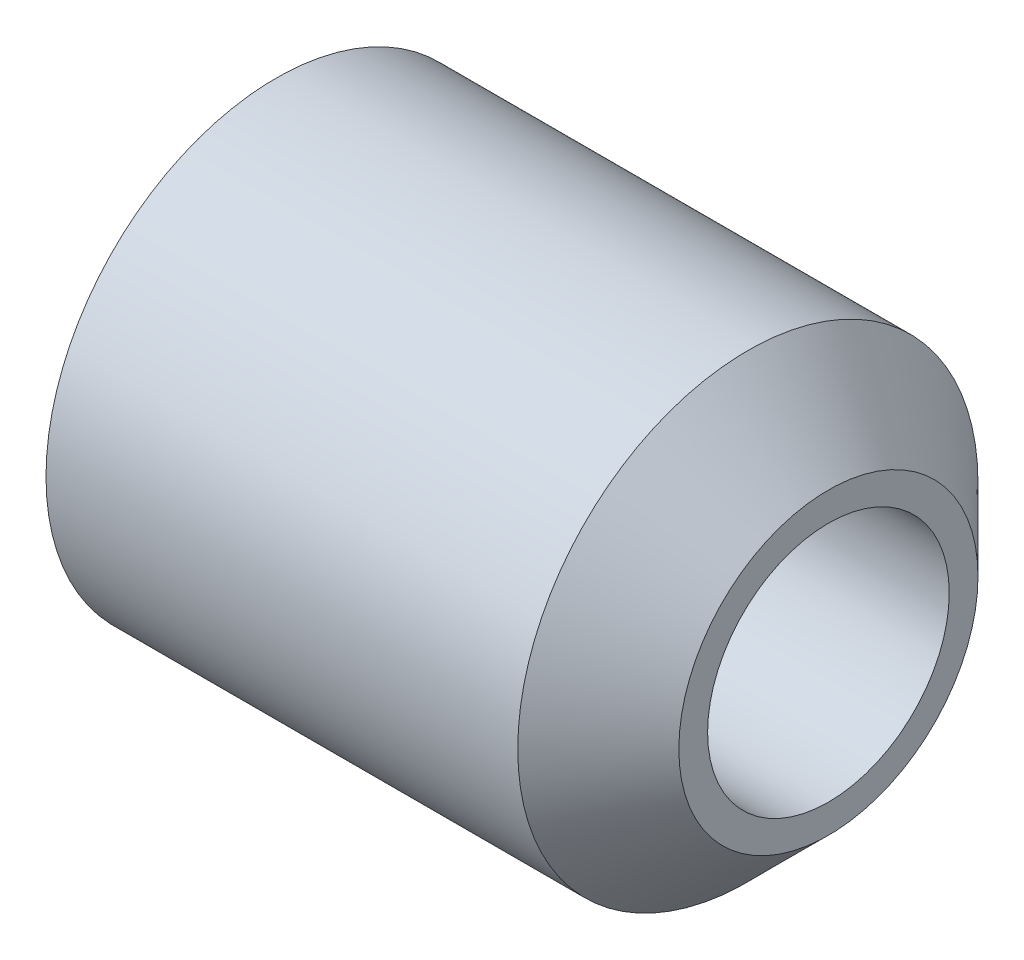
ISO-10303-21;
HEADER;
FILE_DESCRIPTION(('STEP AP214'),'2;1');
FILE_NAME('part.step','',(''),(''),'','','');
FILE_SCHEMA(('AUTOMOTIVE_DESIGN { 1 0 10303 214 1 1 1 1 }'));
ENDSEC;
DATA;
#1=APPLICATION_CONTEXT('core data for automotive mechanical design processes');
#2=APPLICATION_PROTOCOL_DEFINITION('international standard','automotive_design',2000,#1);
#3=PRODUCT_CONTEXT('',#1,'mechanical');
#4=PRODUCT('Part','Part','',(#3));
#5=PRODUCT_RELATED_PRODUCT_CATEGORY('part','',(#4));
#6=PRODUCT_DEFINITION_FORMATION('','',#4);
#7=PRODUCT_DEFINITION_CONTEXT('part definition',#1,'design');
#8=PRODUCT_DEFINITION('design','',#6,#7);
#9=PRODUCT_DEFINITION_SHAPE('','',#8);
#10=(LENGTH_UNIT() NAMED_UNIT(*) SI_UNIT(.MILLI.,.METRE.));
#11=(NAMED_UNIT(*) PLANE_ANGLE_UNIT() SI_UNIT($,.RADIAN.));
#12=(NAMED_UNIT(*) SI_UNIT($,.STERADIAN.) SOLID_ANGLE_UNIT());
#13=UNCERTAINTY_MEASURE_WITH_UNIT(LENGTH_MEASURE(1.E-05),#10,'distance_accuracy_value','');
#14=(GEOMETRIC_REPRESENTATION_CONTEXT(3) GLOBAL_UNCERTAINTY_ASSIGNED_CONTEXT((#13)) GLOBAL_UNIT_ASSIGNED_CONTEXT((#10,
#11,#12)) REPRESENTATION_CONTEXT('',''));
#15=CARTESIAN_POINT('',(0.,0.,0.));
#16=DIRECTION('',(0.,0.,1.));
#17=DIRECTION('',(1.,0.,0.));
#18=AXIS2_PLACEMENT_3D('',#15,#16,#17);
#19=CARTESIAN_POINT('',(24.,0.,0.));
#20=DIRECTION('',(1.,0.,0.));
#21=DIRECTION('',(0.,0.,-1.));
#22=AXIS2_PLACEMENT_3D('',#19,#20,#21);
#23=PLANE('',#22);
#24=CARTESIAN_POINT('',(24.,0.,0.));
#25=DIRECTION('',(1.,0.,0.));
#26=DIRECTION('',(0.,0.,-1.));
#27=AXIS2_PLACEMENT_3D('',#24,#25,#26);
#28=CIRCLE('',#27,6.50000000000001);
#29=CARTESIAN_POINT('',(24.,0.,6.50000000000001));
#30=VERTEX_POINT('',#29);
#31=EDGE_CURVE('E52',#30,#30,#28,.T.);
#32=ORIENTED_EDGE('',*,*,#31,.T.);
#33=EDGE_LOOP('',(#32));
#34=FACE_BOUND('',#33,.T.);
#35=CARTESIAN_POINT('',(24.,0.,0.));
#36=DIRECTION('',(1.,0.,0.));
#37=DIRECTION('',(0.,0.,-1.));
#38=AXIS2_PLACEMENT_3D('',#35,#36,#37);
#39=CIRCLE('',#38,5.25);
#40=CARTESIAN_POINT('',(24.,0.,-5.25));
#41=VERTEX_POINT('',#40);
#42=EDGE_CURVE('E65',#41,#41,#39,.T.);
#43=ORIENTED_EDGE('',*,*,#42,.F.);
#44=EDGE_LOOP('',(#43));
#45=FACE_BOUND('',#44,.T.);
#46=ADVANCED_FACE('F43',(#34,#45),#23,.T.);
#47=CARTESIAN_POINT('',(0.,0.,0.));
#48=DIRECTION('',(1.,0.,0.));
#49=DIRECTION('',(0.,0.,-1.));
#50=AXIS2_PLACEMENT_3D('',#47,#48,#49);
#51=PLANE('',#50);
#52=CARTESIAN_POINT('',(0.,0.,0.));
#53=DIRECTION('',(1.,0.,0.));
#54=DIRECTION('',(0.,0.,-1.));
#55=AXIS2_PLACEMENT_3D('',#52,#53,#54);
#56=CIRCLE('',#55,10.);
#57=CARTESIAN_POINT('',(0.,0.,-10.));
#58=VERTEX_POINT('',#57);
#59=EDGE_CURVE('E59',#58,#58,#56,.T.);
#60=ORIENTED_EDGE('',*,*,#59,.F.);
#61=EDGE_LOOP('',(#60));
#62=FACE_BOUND('',#61,.T.);
#63=CARTESIAN_POINT('',(0.,0.,0.));
#64=DIRECTION('',(1.,0.,0.));
#65=DIRECTION('',(0.,0.,-1.));
#66=AXIS2_PLACEMENT_3D('',#63,#64,#65);
#67=CIRCLE('',#66,5.25);
#68=CARTESIAN_POINT('',(0.,0.,-5.25));
#69=VERTEX_POINT('',#68);
#70=EDGE_CURVE('E68',#69,#69,#67,.T.);
#71=ORIENTED_EDGE('',*,*,#70,.T.);
#72=EDGE_LOOP('',(#71));
#73=FACE_BOUND('',#72,.T.);
#74=ADVANCED_FACE('F80',(#62,#73),#51,.F.);
#75=CARTESIAN_POINT('',(24.,0.,0.));
#76=DIRECTION('',(-1.,0.,0.));
#77=DIRECTION('',(0.,0.,1.));
#78=AXIS2_PLACEMENT_3D('',#75,#76,#77);
#79=CYLINDRICAL_SURFACE('',#78,10.);
#80=CARTESIAN_POINT('',(20.5,0.,0.));
#81=DIRECTION('',(1.,0.,0.));
#82=DIRECTION('',(0.,0.,-1.));
#83=AXIS2_PLACEMENT_3D('',#80,#81,#82);
#84=CIRCLE('',#83,10.);
#85=CARTESIAN_POINT('',(20.5,0.,10.));
#86=VERTEX_POINT('',#85);
#87=EDGE_CURVE('E10',#86,#86,#84,.F.);
#88=ORIENTED_EDGE('',*,*,#87,.T.);
#89=EDGE_LOOP('',(#88));
#90=FACE_BOUND('',#89,.T.);
#91=ORIENTED_EDGE('',*,*,#59,.T.);
#92=EDGE_LOOP('',(#91));
#93=FACE_BOUND('',#92,.T.);
#94=ADVANCED_FACE('F85',(#90,#93),#79,.T.);
#95=CARTESIAN_POINT('',(24.,0.,0.));
#96=DIRECTION('',(-1.,0.,0.));
#97=DIRECTION('',(0.,0.,1.));
#98=AXIS2_PLACEMENT_3D('',#95,#96,#97);
#99=CYLINDRICAL_SURFACE('',#98,5.25);
#100=ORIENTED_EDGE('',*,*,#42,.T.);
#101=EDGE_LOOP('',(#100));
#102=FACE_BOUND('',#101,.T.);
#103=ORIENTED_EDGE('',*,*,#70,.F.);
#104=EDGE_LOOP('',(#103));
#105=FACE_BOUND('',#104,.T.);
#106=ADVANCED_FACE('F76',(#102,#105),#99,.F.);
#107=CARTESIAN_POINT('',(24.,0.,0.));
#108=DIRECTION('',(-1.,0.,0.));
#109=DIRECTION('',(0.,0.,1.));
#110=AXIS2_PLACEMENT_3D('',#107,#108,#109);
#111=CONICAL_SURFACE('',#110,6.50000000000001,0.785398163397446);
#112=CARTESIAN_POINT('',(20.5,0.,10.));
#113=CARTESIAN_POINT('',(20.5364583333333,0.,9.96354166666667));
#114=CARTESIAN_POINT('',(20.5729166666667,0.,9.92708333333334));
#115=CARTESIAN_POINT('',(20.6458333333333,0.,9.85416666666667));
#116=CARTESIAN_POINT('',(20.6822916666667,0.,9.81770833333334));
#117=CARTESIAN_POINT('',(20.7552083333333,0.,9.74479166666667));
#118=CARTESIAN_POINT('',(20.7916666666667,0.,9.70833333333334));
#119=CARTESIAN_POINT('',(20.8645833333333,0.,9.63541666666667));
#120=CARTESIAN_POINT('',(20.9010416666667,0.,9.59895833333334));
#121=CARTESIAN_POINT('',(20.9739583333333,0.,9.52604166666667));
#122=CARTESIAN_POINT('',(21.0104166666667,0.,9.48958333333334));
#123=CARTESIAN_POINT('',(21.0833333333333,0.,9.41666666666667));
#124=CARTESIAN_POINT('',(21.1197916666667,0.,9.38020833333334));
#125=CARTESIAN_POINT('',(21.1927083333333,0.,9.30729166666667));
#126=CARTESIAN_POINT('',(21.2291666666667,0.,9.27083333333334));
#127=CARTESIAN_POINT('',(21.3020833333333,0.,9.19791666666667));
#128=CARTESIAN_POINT('',(21.3385416666667,0.,9.16145833333334));
#129=CARTESIAN_POINT('',(21.4114583333333,0.,9.08854166666667));
#130=CARTESIAN_POINT('',(21.4479166666667,0.,9.05208333333334));
#131=CARTESIAN_POINT('',(21.5208333333333,0.,8.97916666666667));
#132=CARTESIAN_POINT('',(21.5572916666667,0.,8.94270833333334));
#133=CARTESIAN_POINT('',(21.6302083333333,0.,8.86979166666667));
#134=CARTESIAN_POINT('',(21.6666666666667,0.,8.83333333333334));
#135=CARTESIAN_POINT('',(21.7395833333333,0.,8.76041666666667));
#136=CARTESIAN_POINT('',(21.7760416666667,0.,8.72395833333334));
#137=CARTESIAN_POINT('',(21.8489583333333,0.,8.65104166666667));
#138=CARTESIAN_POINT('',(21.8854166666667,0.,8.61458333333334));
#139=CARTESIAN_POINT('',(21.9583333333333,0.,8.54166666666667));
#140=CARTESIAN_POINT('',(21.9947916666667,0.,8.50520833333334));
#141=CARTESIAN_POINT('',(22.0677083333333,0.,8.43229166666667));
#142=CARTESIAN_POINT('',(22.1041666666667,0.,8.39583333333334));
#143=CARTESIAN_POINT('',(22.1770833333333,0.,8.32291666666668));
#144=CARTESIAN_POINT('',(22.2135416666667,0.,8.28645833333334));
#145=CARTESIAN_POINT('',(22.2864583333333,0.,8.21354166666667));
#146=CARTESIAN_POINT('',(22.3229166666667,0.,8.17708333333334));
#147=CARTESIAN_POINT('',(22.3958333333333,0.,8.10416666666668));
#148=CARTESIAN_POINT('',(22.4322916666667,0.,8.06770833333334));
#149=CARTESIAN_POINT('',(22.5052083333333,0.,7.99479166666668));
#150=CARTESIAN_POINT('',(22.5416666666667,0.,7.95833333333334));
#151=CARTESIAN_POINT('',(22.6145833333333,0.,7.88541666666668));
#152=CARTESIAN_POINT('',(22.6510416666667,0.,7.84895833333334));
#153=CARTESIAN_POINT('',(22.7239583333333,0.,7.77604166666668));
#154=CARTESIAN_POINT('',(22.7604166666667,0.,7.73958333333334));
#155=CARTESIAN_POINT('',(22.8333333333333,0.,7.66666666666668));
#156=CARTESIAN_POINT('',(22.8697916666667,0.,7.63020833333334));
#157=CARTESIAN_POINT('',(22.9427083333333,0.,7.55729166666668));
#158=CARTESIAN_POINT('',(22.9791666666667,0.,7.52083333333334));
#159=CARTESIAN_POINT('',(23.0520833333333,0.,7.44791666666668));
#160=CARTESIAN_POINT('',(23.0885416666667,0.,7.41145833333335));
#161=CARTESIAN_POINT('',(23.1614583333333,0.,7.33854166666668));
#162=CARTESIAN_POINT('',(23.1979166666667,0.,7.30208333333334));
#163=CARTESIAN_POINT('',(23.2708333333333,0.,7.22916666666668));
#164=CARTESIAN_POINT('',(23.3072916666667,0.,7.19270833333335));
#165=CARTESIAN_POINT('',(23.3802083333333,0.,7.11979166666668));
#166=CARTESIAN_POINT('',(23.4166666666667,0.,7.08333333333335));
#167=CARTESIAN_POINT('',(23.4895833333333,0.,7.01041666666668));
#168=CARTESIAN_POINT('',(23.5260416666667,0.,6.97395833333335));
#169=CARTESIAN_POINT('',(23.5989583333333,0.,6.90104166666668));
#170=CARTESIAN_POINT('',(23.6354166666667,0.,6.86458333333335));
#171=CARTESIAN_POINT('',(23.7083333333333,0.,6.79166666666668));
#172=CARTESIAN_POINT('',(23.7447916666667,0.,6.75520833333335));
#173=CARTESIAN_POINT('',(23.8177083333333,0.,6.68229166666668));
#174=CARTESIAN_POINT('',(23.8541666666667,0.,6.64583333333335));
#175=CARTESIAN_POINT('',(23.9270833333333,0.,6.57291666666668));
#176=CARTESIAN_POINT('',(23.9635416666667,0.,6.53645833333335));
#177=CARTESIAN_POINT('',(24.,0.,6.50000000000001));
#178=B_SPLINE_CURVE_WITH_KNOTS('',3,(#112,#113,#114,#115,#116,#117,#118,#119,#120,#121,#122,
#123,#124,#125,#126,#127,#128,#129,#130,#131,#132,#133,#134,#135,#136,#137,#138,#139,#140,#141,
#142,#143,#144,#145,#146,#147,#148,#149,#150,#151,#152,#153,#154,#155,#156,#157,#158,#159,#160,
#161,#162,#163,#164,#165,#166,#167,#168,#169,#170,#171,#172,#173,#174,#175,#176,#177),
.UNSPECIFIED.,.F.,.F.,(4,2,2,2,2,2,2,2,2,2,2,2,2,2,2,2,2,2,2,2,2,2,2,2,2,2,2,2,2,2,2,2,4),(0.,
0.154679608384557,0.309359216769114,0.464038825153672,0.618718433538227,0.773398041922786,
0.928077650307342,1.0827572586919,1.23743686707646,1.39211647546101,1.54679608384557,
1.70147569223013,1.85615530061469,2.01083490899924,2.1655145173838,2.32019412576836,
2.47487373415291,2.62955334253747,2.78423295092203,2.93891255930659,3.09359216769114,
3.2482717760757,3.40295138446026,3.55763099284481,3.71231060122937,3.86699020961393,
4.02166981799849,4.17634942638304,4.3310290347676,4.48570864315216,4.64038825153671,
4.79506785992127,4.94974746830583),.UNSPECIFIED.);
#179=EDGE_CURVE('BSEAM46',#86,#30,#178,.T.);
#180=ORIENTED_EDGE('',*,*,#87,.F.);
#181=ORIENTED_EDGE('',*,*,#31,.F.);
#182=ORIENTED_EDGE('',*,*,#179,.T.);
#183=ORIENTED_EDGE('',*,*,#179,.F.);
#184=EDGE_LOOP('',(#180,#182,#181,#183));
#185=FACE_BOUND('',#184,.T.);
#186=ADVANCED_FACE('F46',(#185),#111,.T.);
#187=CLOSED_SHELL('',(#46,#74,#94,#106,#186));
#188=MANIFOLD_SOLID_BREP('B2',#187);
#189=ADVANCED_BREP_SHAPE_REPRESENTATION('',(#18,#188),#14);
#190=SHAPE_DEFINITION_REPRESENTATION(#9,#189);
ENDSEC;
END-ISO-10303-21;
